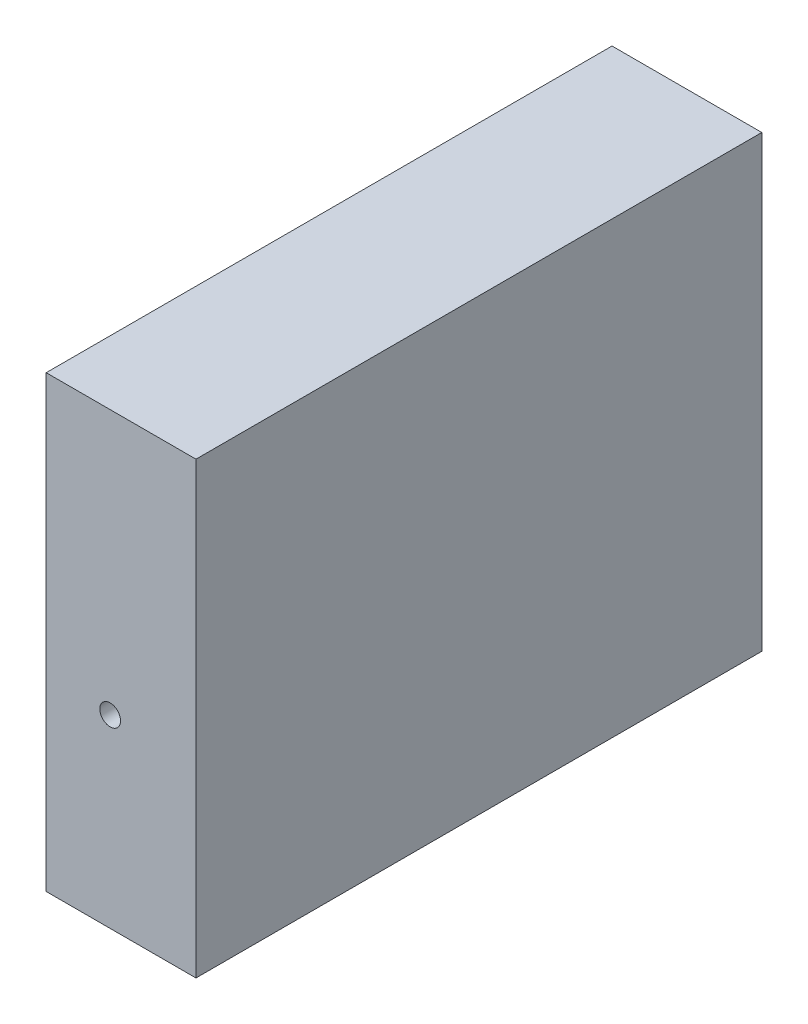
ISO-10303-21;
HEADER;
FILE_DESCRIPTION(('STEP AP214'),'2;1');
FILE_NAME('part.step','',(''),(''),'','','');
FILE_SCHEMA(('AUTOMOTIVE_DESIGN { 1 0 10303 214 1 1 1 1 }'));
ENDSEC;
DATA;
#1=APPLICATION_CONTEXT('core data for automotive mechanical design processes');
#2=APPLICATION_PROTOCOL_DEFINITION('international standard','automotive_design',2000,#1);
#3=PRODUCT_CONTEXT('',#1,'mechanical');
#4=PRODUCT('Part','Part','',(#3));
#5=PRODUCT_RELATED_PRODUCT_CATEGORY('part','',(#4));
#6=PRODUCT_DEFINITION_FORMATION('','',#4);
#7=PRODUCT_DEFINITION_CONTEXT('part definition',#1,'design');
#8=PRODUCT_DEFINITION('design','',#6,#7);
#9=PRODUCT_DEFINITION_SHAPE('','',#8);
#10=(LENGTH_UNIT() NAMED_UNIT(*) SI_UNIT(.MILLI.,.METRE.));
#11=(NAMED_UNIT(*) PLANE_ANGLE_UNIT() SI_UNIT($,.RADIAN.));
#12=(NAMED_UNIT(*) SI_UNIT($,.STERADIAN.) SOLID_ANGLE_UNIT());
#13=UNCERTAINTY_MEASURE_WITH_UNIT(LENGTH_MEASURE(1.E-05),#10,'distance_accuracy_value','');
#14=(GEOMETRIC_REPRESENTATION_CONTEXT(3) GLOBAL_UNCERTAINTY_ASSIGNED_CONTEXT((#13)) GLOBAL_UNIT_ASSIGNED_CONTEXT((#10,
#11,#12)) REPRESENTATION_CONTEXT('',''));
#15=CARTESIAN_POINT('',(0.,0.,0.));
#16=DIRECTION('',(0.,0.,1.));
#17=DIRECTION('',(1.,0.,0.));
#18=AXIS2_PLACEMENT_3D('',#15,#16,#17);
#19=CARTESIAN_POINT('',(0.,0.,-215.9));
#20=DIRECTION('',(1.,0.,0.));
#21=DIRECTION('',(0.,0.,1.));
#22=AXIS2_PLACEMENT_3D('',#19,#20,#21);
#23=PLANE('',#22);
#24=DIRECTION('',(0.,-1.,0.));
#25=VECTOR('',#24,1.);
#26=CARTESIAN_POINT('',(0.,0.,0.));
#27=LINE('',#26,#25);
#28=CARTESIAN_POINT('',(0.,171.45,0.));
#29=VERTEX_POINT('',#28);
#30=CARTESIAN_POINT('',(0.,0.,0.));
#31=VERTEX_POINT('',#30);
#32=EDGE_CURVE('E119',#29,#31,#27,.T.);
#33=ORIENTED_EDGE('',*,*,#32,.F.);
#34=DIRECTION('',(0.,0.,1.));
#35=VECTOR('',#34,1.);
#36=CARTESIAN_POINT('',(0.,171.45,-215.9));
#37=LINE('',#36,#35);
#38=CARTESIAN_POINT('',(0.,171.45,-215.9));
#39=VERTEX_POINT('',#38);
#40=EDGE_CURVE('E118',#39,#29,#37,.T.);
#41=ORIENTED_EDGE('',*,*,#40,.F.);
#42=DIRECTION('',(0.,-1.,0.));
#43=VECTOR('',#42,1.);
#44=CARTESIAN_POINT('',(0.,0.,-215.9));
#45=LINE('',#44,#43);
#46=CARTESIAN_POINT('',(0.,0.,-215.9));
#47=VERTEX_POINT('',#46);
#48=EDGE_CURVE('E109',#39,#47,#45,.T.);
#49=ORIENTED_EDGE('',*,*,#48,.T.);
#50=DIRECTION('',(0.,0.,1.));
#51=VECTOR('',#50,1.);
#52=CARTESIAN_POINT('',(0.,0.,-215.9));
#53=LINE('',#52,#51);
#54=EDGE_CURVE('E11',#47,#31,#53,.T.);
#55=ORIENTED_EDGE('',*,*,#54,.T.);
#56=EDGE_LOOP('',(#33,#41,#49,#55));
#57=FACE_BOUND('',#56,.T.);
#58=ADVANCED_FACE('F45',(#57),#23,.F.);
#59=CARTESIAN_POINT('',(0.,0.,-215.9));
#60=DIRECTION('',(0.,1.,0.));
#61=DIRECTION('',(0.,0.,-1.));
#62=AXIS2_PLACEMENT_3D('',#59,#60,#61);
#63=PLANE('',#62);
#64=DIRECTION('',(1.,0.,0.));
#65=VECTOR('',#64,1.);
#66=CARTESIAN_POINT('',(0.,0.,0.));
#67=LINE('',#66,#65);
#68=CARTESIAN_POINT('',(57.15,0.,0.));
#69=VERTEX_POINT('',#68);
#70=EDGE_CURVE('E122',#31,#69,#67,.T.);
#71=ORIENTED_EDGE('',*,*,#70,.F.);
#72=ORIENTED_EDGE('',*,*,#54,.F.);
#73=DIRECTION('',(1.,0.,0.));
#74=VECTOR('',#73,1.);
#75=CARTESIAN_POINT('',(0.,0.,-215.9));
#76=LINE('',#75,#74);
#77=CARTESIAN_POINT('',(57.15,0.,-215.9));
#78=VERTEX_POINT('',#77);
#79=EDGE_CURVE('E89',#47,#78,#76,.T.);
#80=ORIENTED_EDGE('',*,*,#79,.T.);
#81=DIRECTION('',(0.,0.,1.));
#82=VECTOR('',#81,1.);
#83=CARTESIAN_POINT('',(57.15,0.,-215.9));
#84=LINE('',#83,#82);
#85=EDGE_CURVE('E55',#78,#69,#84,.T.);
#86=ORIENTED_EDGE('',*,*,#85,.T.);
#87=EDGE_LOOP('',(#71,#72,#80,#86));
#88=FACE_BOUND('',#87,.T.);
#89=ADVANCED_FACE('F106',(#88),#63,.F.);
#90=CARTESIAN_POINT('',(57.15,0.,-215.9));
#91=DIRECTION('',(-1.,0.,0.));
#92=DIRECTION('',(0.,0.,-1.));
#93=AXIS2_PLACEMENT_3D('',#90,#91,#92);
#94=PLANE('',#93);
#95=DIRECTION('',(0.,1.,0.));
#96=VECTOR('',#95,1.);
#97=CARTESIAN_POINT('',(57.15,0.,0.));
#98=LINE('',#97,#96);
#99=CARTESIAN_POINT('',(57.15,171.45,0.));
#100=VERTEX_POINT('',#99);
#101=EDGE_CURVE('E100',#69,#100,#98,.T.);
#102=ORIENTED_EDGE('',*,*,#101,.F.);
#103=ORIENTED_EDGE('',*,*,#85,.F.);
#104=DIRECTION('',(0.,1.,0.));
#105=VECTOR('',#104,1.);
#106=CARTESIAN_POINT('',(57.15,0.,-215.9));
#107=LINE('',#106,#105);
#108=CARTESIAN_POINT('',(57.15,171.45,-215.9));
#109=VERTEX_POINT('',#108);
#110=EDGE_CURVE('E92',#78,#109,#107,.T.);
#111=ORIENTED_EDGE('',*,*,#110,.T.);
#112=DIRECTION('',(0.,0.,1.));
#113=VECTOR('',#112,1.);
#114=CARTESIAN_POINT('',(57.15,171.45,-215.9));
#115=LINE('',#114,#113);
#116=EDGE_CURVE('E104',#109,#100,#115,.T.);
#117=ORIENTED_EDGE('',*,*,#116,.T.);
#118=EDGE_LOOP('',(#102,#103,#111,#117));
#119=FACE_BOUND('',#118,.T.);
#120=ADVANCED_FACE('F99',(#119),#94,.F.);
#121=CARTESIAN_POINT('',(0.,171.45,-215.9));
#122=DIRECTION('',(0.,-1.,0.));
#123=DIRECTION('',(0.,0.,1.));
#124=AXIS2_PLACEMENT_3D('',#121,#122,#123);
#125=PLANE('',#124);
#126=DIRECTION('',(-1.,0.,0.));
#127=VECTOR('',#126,1.);
#128=CARTESIAN_POINT('',(0.,171.45,0.));
#129=LINE('',#128,#127);
#130=EDGE_CURVE('E78',#100,#29,#129,.T.);
#131=ORIENTED_EDGE('',*,*,#130,.F.);
#132=ORIENTED_EDGE('',*,*,#116,.F.);
#133=DIRECTION('',(-1.,0.,0.));
#134=VECTOR('',#133,1.);
#135=CARTESIAN_POINT('',(0.,171.45,-215.9));
#136=LINE('',#135,#134);
#137=EDGE_CURVE('E64',#109,#39,#136,.T.);
#138=ORIENTED_EDGE('',*,*,#137,.T.);
#139=ORIENTED_EDGE('',*,*,#40,.T.);
#140=EDGE_LOOP('',(#131,#132,#138,#139));
#141=FACE_BOUND('',#140,.T.);
#142=ADVANCED_FACE('F212',(#141),#125,.F.);
#143=CARTESIAN_POINT('',(0.,0.,-215.9));
#144=DIRECTION('',(0.,0.,1.));
#145=DIRECTION('',(-1.,0.,0.));
#146=AXIS2_PLACEMENT_3D('',#143,#144,#145);
#147=PLANE('',#146);
#148=CARTESIAN_POINT('',(23.13,10.5690000000002,-215.9));
#149=DIRECTION('',(0.,0.,1.));
#150=DIRECTION('',(1.,0.,0.));
#151=AXIS2_PLACEMENT_3D('',#148,#149,#150);
#152=CIRCLE('',#151,3.96874999999996);
#153=CARTESIAN_POINT('',(27.0987499999999,10.5690000000002,-215.9));
#154=VERTEX_POINT('',#153);
#155=EDGE_CURVE('E395',#154,#154,#152,.T.);
#156=ORIENTED_EDGE('',*,*,#155,.T.);
#157=EDGE_LOOP('',(#156));
#158=FACE_BOUND('',#157,.T.);
#159=CARTESIAN_POINT('',(26.41,98.5690000000001,-215.9));
#160=DIRECTION('',(0.,0.,1.));
#161=DIRECTION('',(1.,0.,0.));
#162=AXIS2_PLACEMENT_3D('',#159,#160,#161);
#163=CIRCLE('',#162,3.96874999999997);
#164=CARTESIAN_POINT('',(30.37875,98.5690000000001,-215.9));
#165=VERTEX_POINT('',#164);
#166=EDGE_CURVE('E406',#165,#165,#163,.T.);
#167=ORIENTED_EDGE('',*,*,#166,.T.);
#168=EDGE_LOOP('',(#167));
#169=FACE_BOUND('',#168,.T.);
#170=CARTESIAN_POINT('',(26.41,73.5690000000001,-215.9));
#171=DIRECTION('',(0.,0.,1.));
#172=DIRECTION('',(1.,0.,0.));
#173=AXIS2_PLACEMENT_3D('',#170,#171,#172);
#174=CIRCLE('',#173,3.96874999999997);
#175=CARTESIAN_POINT('',(30.37875,73.5690000000001,-215.9));
#176=VERTEX_POINT('',#175);
#177=EDGE_CURVE('E393',#176,#176,#174,.T.);
#178=ORIENTED_EDGE('',*,*,#177,.T.);
#179=EDGE_LOOP('',(#178));
#180=FACE_BOUND('',#179,.T.);
#181=ORIENTED_EDGE('',*,*,#48,.F.);
#182=ORIENTED_EDGE('',*,*,#137,.F.);
#183=ORIENTED_EDGE('',*,*,#110,.F.);
#184=ORIENTED_EDGE('',*,*,#79,.F.);
#185=EDGE_LOOP('',(#181,#182,#183,#184));
#186=FACE_BOUND('',#185,.T.);
#187=ADVANCED_FACE('F94',(#158,#169,#180,#186),#147,.F.);
#188=CARTESIAN_POINT('',(0.,0.,0.));
#189=DIRECTION('',(0.,0.,1.));
#190=DIRECTION('',(-1.,0.,0.));
#191=AXIS2_PLACEMENT_3D('',#188,#189,#190);
#192=PLANE('',#191);
#193=CARTESIAN_POINT('',(24.41,70.5690000000001,0.));
#194=DIRECTION('',(0.,0.,-1.));
#195=DIRECTION('',(-1.,0.,0.));
#196=AXIS2_PLACEMENT_3D('',#193,#194,#195);
#197=CIRCLE('',#196,3.96874999999997);
#198=CARTESIAN_POINT('',(20.4412500000001,70.5690000000001,0.));
#199=VERTEX_POINT('',#198);
#200=EDGE_CURVE('E167',#199,#199,#197,.T.);
#201=ORIENTED_EDGE('',*,*,#200,.T.);
#202=EDGE_LOOP('',(#201));
#203=FACE_BOUND('',#202,.T.);
#204=ORIENTED_EDGE('',*,*,#32,.T.);
#205=ORIENTED_EDGE('',*,*,#70,.T.);
#206=ORIENTED_EDGE('',*,*,#101,.T.);
#207=ORIENTED_EDGE('',*,*,#130,.T.);
#208=EDGE_LOOP('',(#204,#205,#206,#207));
#209=FACE_BOUND('',#208,.T.);
#210=ADVANCED_FACE('F202',(#203,#209),#192,.T.);
#211=CARTESIAN_POINT('',(24.41,70.5690000000001,-13.0400044));
#212=DIRECTION('',(0.,0.,1.));
#213=DIRECTION('',(-1.,0.,0.));
#214=AXIS2_PLACEMENT_3D('',#211,#212,#213);
#215=PLANE('',#214);
#216=CARTESIAN_POINT('',(24.41,70.5690000000001,-13.0400044));
#217=DIRECTION('',(0.,0.,-1.));
#218=DIRECTION('',(-1.,0.,0.));
#219=AXIS2_PLACEMENT_3D('',#216,#217,#218);
#220=CIRCLE('',#219,3.96874999999997);
#221=CARTESIAN_POINT('',(20.4412500000001,70.5690000000001,-13.0400044));
#222=VERTEX_POINT('',#221);
#223=EDGE_CURVE('E138',#222,#222,#220,.T.);
#224=ORIENTED_EDGE('',*,*,#223,.F.);
#225=EDGE_LOOP('',(#224));
#226=FACE_BOUND('',#225,.T.);
#227=CARTESIAN_POINT('',(24.41,70.5690000000001,-13.0400044));
#228=DIRECTION('',(0.,0.,-1.));
#229=DIRECTION('',(-1.,0.,0.));
#230=AXIS2_PLACEMENT_3D('',#227,#228,#229);
#231=CIRCLE('',#230,3.17500000000004);
#232=CARTESIAN_POINT('',(21.235,70.5690000000001,-13.0400044));
#233=VERTEX_POINT('',#232);
#234=EDGE_CURVE('E134',#233,#233,#231,.F.);
#235=ORIENTED_EDGE('',*,*,#234,.F.);
#236=EDGE_LOOP('',(#235));
#237=FACE_BOUND('',#236,.T.);
#238=ADVANCED_FACE('F192',(#226,#237),#215,.T.);
#239=CARTESIAN_POINT('',(24.41,70.5690000000001,-13.0400044));
#240=DIRECTION('',(0.,0.,1.));
#241=DIRECTION('',(-1.,0.,0.));
#242=AXIS2_PLACEMENT_3D('',#239,#240,#241);
#243=CYLINDRICAL_SURFACE('',#242,3.96874999999997);
#244=ORIENTED_EDGE('',*,*,#223,.T.);
#245=EDGE_LOOP('',(#244));
#246=FACE_BOUND('',#245,.T.);
#247=ORIENTED_EDGE('',*,*,#200,.F.);
#248=EDGE_LOOP('',(#247));
#249=FACE_BOUND('',#248,.T.);
#250=ADVANCED_FACE('F184',(#246,#249),#243,.F.);
#251=CARTESIAN_POINT('',(24.41,70.5690000000001,-46.7399878));
#252=DIRECTION('',(0.,0.,1.));
#253=DIRECTION('',(-1.,0.,0.));
#254=AXIS2_PLACEMENT_3D('',#251,#252,#253);
#255=PLANE('',#254);
#256=CARTESIAN_POINT('',(24.41,70.5690000000001,-46.7399878));
#257=DIRECTION('',(0.,0.,-1.));
#258=DIRECTION('',(-1.,0.,0.));
#259=AXIS2_PLACEMENT_3D('',#256,#257,#258);
#260=CIRCLE('',#259,3.17500000000004);
#261=CARTESIAN_POINT('',(21.235,70.5690000000001,-46.7399878));
#262=VERTEX_POINT('',#261);
#263=EDGE_CURVE('E123',#262,#262,#260,.T.);
#264=ORIENTED_EDGE('',*,*,#263,.F.);
#265=EDGE_LOOP('',(#264));
#266=FACE_BOUND('',#265,.T.);
#267=ADVANCED_FACE('F182',(#266),#255,.T.);
#268=CARTESIAN_POINT('',(24.41,70.5690000000001,-46.7399878));
#269=DIRECTION('',(0.,0.,1.));
#270=DIRECTION('',(-1.,0.,0.));
#271=AXIS2_PLACEMENT_3D('',#268,#269,#270);
#272=CYLINDRICAL_SURFACE('',#271,3.17500000000004);
#273=CARTESIAN_POINT('',(21.235,70.5690000000001,-46.7399878));
#274=CARTESIAN_POINT('',(21.235,70.5690000000001,-46.38894630625));
#275=CARTESIAN_POINT('',(21.235,70.5690000000001,-46.0379048125));
#276=CARTESIAN_POINT('',(21.235,70.5690000000001,-45.335821825));
#277=CARTESIAN_POINT('',(21.235,70.5690000000001,-44.98478033125));
#278=CARTESIAN_POINT('',(21.235,70.5690000000001,-44.28269734375));
#279=CARTESIAN_POINT('',(21.235,70.5690000000001,-43.93165585));
#280=CARTESIAN_POINT('',(21.235,70.5690000000001,-43.2295728625));
#281=CARTESIAN_POINT('',(21.235,70.5690000000001,-42.87853136875));
#282=CARTESIAN_POINT('',(21.235,70.5690000000001,-42.17644838125));
#283=CARTESIAN_POINT('',(21.235,70.5690000000001,-41.8254068875));
#284=CARTESIAN_POINT('',(21.235,70.5690000000001,-41.1233239));
#285=CARTESIAN_POINT('',(21.235,70.5690000000001,-40.77228240625));
#286=CARTESIAN_POINT('',(21.235,70.5690000000001,-40.07019941875));
#287=CARTESIAN_POINT('',(21.235,70.5690000000001,-39.719157925));
#288=CARTESIAN_POINT('',(21.235,70.5690000000001,-39.0170749375));
#289=CARTESIAN_POINT('',(21.235,70.5690000000001,-38.66603344375));
#290=CARTESIAN_POINT('',(21.235,70.5690000000001,-37.96395045625));
#291=CARTESIAN_POINT('',(21.235,70.5690000000001,-37.6129089625));
#292=CARTESIAN_POINT('',(21.235,70.5690000000001,-36.910825975));
#293=CARTESIAN_POINT('',(21.235,70.5690000000001,-36.55978448125));
#294=CARTESIAN_POINT('',(21.235,70.5690000000001,-35.85770149375));
#295=CARTESIAN_POINT('',(21.235,70.5690000000001,-35.50666));
#296=CARTESIAN_POINT('',(21.235,70.5690000000001,-34.8045770125));
#297=CARTESIAN_POINT('',(21.235,70.5690000000001,-34.45353551875));
#298=CARTESIAN_POINT('',(21.235,70.5690000000001,-33.75145253125));
#299=CARTESIAN_POINT('',(21.235,70.5690000000001,-33.4004110375));
#300=CARTESIAN_POINT('',(21.235,70.5690000000001,-32.69832805));
#301=CARTESIAN_POINT('',(21.235,70.5690000000001,-32.34728655625));
#302=CARTESIAN_POINT('',(21.235,70.5690000000001,-31.64520356875));
#303=CARTESIAN_POINT('',(21.235,70.5690000000001,-31.294162075));
#304=CARTESIAN_POINT('',(21.235,70.5690000000001,-30.5920790875));
#305=CARTESIAN_POINT('',(21.235,70.5690000000001,-30.24103759375));
#306=CARTESIAN_POINT('',(21.235,70.5690000000001,-29.53895460625));
#307=CARTESIAN_POINT('',(21.235,70.5690000000001,-29.1879131125));
#308=CARTESIAN_POINT('',(21.235,70.5690000000001,-28.485830125));
#309=CARTESIAN_POINT('',(21.235,70.5690000000001,-28.13478863125));
#310=CARTESIAN_POINT('',(21.235,70.5690000000001,-27.43270564375));
#311=CARTESIAN_POINT('',(21.235,70.5690000000001,-27.08166415));
#312=CARTESIAN_POINT('',(21.235,70.5690000000001,-26.3795811625));
#313=CARTESIAN_POINT('',(21.235,70.5690000000001,-26.02853966875));
#314=CARTESIAN_POINT('',(21.235,70.5690000000001,-25.32645668125));
#315=CARTESIAN_POINT('',(21.235,70.5690000000001,-24.9754151875));
#316=CARTESIAN_POINT('',(21.235,70.5690000000001,-24.2733322));
#317=CARTESIAN_POINT('',(21.235,70.5690000000001,-23.92229070625));
#318=CARTESIAN_POINT('',(21.235,70.5690000000001,-23.22020771875));
#319=CARTESIAN_POINT('',(21.235,70.5690000000001,-22.869166225));
#320=CARTESIAN_POINT('',(21.235,70.5690000000001,-22.1670832375));
#321=CARTESIAN_POINT('',(21.235,70.5690000000001,-21.81604174375));
#322=CARTESIAN_POINT('',(21.235,70.5690000000001,-21.11395875625));
#323=CARTESIAN_POINT('',(21.235,70.5690000000001,-20.7629172625));
#324=CARTESIAN_POINT('',(21.235,70.5690000000001,-20.060834275));
#325=CARTESIAN_POINT('',(21.235,70.5690000000001,-19.70979278125));
#326=CARTESIAN_POINT('',(21.235,70.5690000000001,-19.00770979375));
#327=CARTESIAN_POINT('',(21.235,70.5690000000001,-18.6566683));
#328=CARTESIAN_POINT('',(21.235,70.5690000000001,-17.9545853125));
#329=CARTESIAN_POINT('',(21.235,70.5690000000001,-17.60354381875));
#330=CARTESIAN_POINT('',(21.235,70.5690000000001,-16.90146083125));
#331=CARTESIAN_POINT('',(21.235,70.5690000000001,-16.5504193375));
#332=CARTESIAN_POINT('',(21.235,70.5690000000001,-15.84833635));
#333=CARTESIAN_POINT('',(21.235,70.5690000000001,-15.49729485625));
#334=CARTESIAN_POINT('',(21.235,70.5690000000001,-14.79521186875));
#335=CARTESIAN_POINT('',(21.235,70.5690000000001,-14.444170375));
#336=CARTESIAN_POINT('',(21.235,70.5690000000001,-13.7420873875));
#337=CARTESIAN_POINT('',(21.235,70.5690000000001,-13.39104589375));
#338=CARTESIAN_POINT('',(21.235,70.5690000000001,-13.0400044));
#339=B_SPLINE_CURVE_WITH_KNOTS('',3,(#273,#274,#275,#276,#277,#278,#279,#280,#281,#282,#283,
#284,#285,#286,#287,#288,#289,#290,#291,#292,#293,#294,#295,#296,#297,#298,#299,#300,#301,#302,
#303,#304,#305,#306,#307,#308,#309,#310,#311,#312,#313,#314,#315,#316,#317,#318,#319,#320,#321,
#322,#323,#324,#325,#326,#327,#328,#329,#330,#331,#332,#333,#334,#335,#336,#337,#338),
.UNSPECIFIED.,.F.,.F.,(4,2,2,2,2,2,2,2,2,2,2,2,2,2,2,2,2,2,2,2,2,2,2,2,2,2,2,2,2,2,2,2,4),(0.,
1.05312448125,2.1062489625,3.15937344375,4.212497925,5.26562240625,6.3187468875,
7.37187136875001,8.42499585000001,9.47812033125001,10.5312448125,11.58436929375,12.637493775,
13.69061825625,14.7437427375,15.79686721875,16.8499917,17.90311618125,18.9562406625,
20.00936514375,21.062489625,22.11561410625,23.1687385875,24.22186306875,25.27498755,
26.32811203125,27.3812365125,28.43436099375,29.487485475,30.54060995625,31.5937344375,
32.64685891875,33.6999834),.UNSPECIFIED.);
#340=EDGE_CURVE('BSEAM179',#262,#233,#339,.T.);
#341=ORIENTED_EDGE('',*,*,#263,.T.);
#342=ORIENTED_EDGE('',*,*,#234,.T.);
#343=ORIENTED_EDGE('',*,*,#340,.T.);
#344=ORIENTED_EDGE('',*,*,#340,.F.);
#345=EDGE_LOOP('',(#341,#343,#342,#344));
#346=FACE_BOUND('',#345,.T.);
#347=ADVANCED_FACE('F179',(#346),#272,.F.);
#348=CARTESIAN_POINT('',(26.41,98.5690000000001,-205.74));
#349=DIRECTION('',(0.,0.,-1.));
#350=DIRECTION('',(1.,0.,0.));
#351=AXIS2_PLACEMENT_3D('',#348,#349,#350);
#352=PLANE('',#351);
#353=CARTESIAN_POINT('',(26.41,98.5690000000001,-205.74));
#354=DIRECTION('',(0.,0.,1.));
#355=DIRECTION('',(1.,0.,0.));
#356=AXIS2_PLACEMENT_3D('',#353,#354,#355);
#357=CIRCLE('',#356,3.96874999999997);
#358=CARTESIAN_POINT('',(30.37875,98.5690000000001,-205.74));
#359=VERTEX_POINT('',#358);
#360=EDGE_CURVE('E143',#359,#359,#357,.T.);
#361=ORIENTED_EDGE('',*,*,#360,.F.);
#362=EDGE_LOOP('',(#361));
#363=FACE_BOUND('',#362,.T.);
#364=CARTESIAN_POINT('',(26.41,98.5690000000001,-205.74));
#365=DIRECTION('',(0.,0.,1.));
#366=DIRECTION('',(1.,0.,0.));
#367=AXIS2_PLACEMENT_3D('',#364,#365,#366);
#368=CIRCLE('',#367,3.17500000000004);
#369=CARTESIAN_POINT('',(29.5850000000001,98.5690000000001,-205.74));
#370=VERTEX_POINT('',#369);
#371=EDGE_CURVE('E139',#370,#370,#368,.F.);
#372=ORIENTED_EDGE('',*,*,#371,.F.);
#373=EDGE_LOOP('',(#372));
#374=FACE_BOUND('',#373,.T.);
#375=ADVANCED_FACE('F190',(#363,#374),#352,.T.);
#376=CARTESIAN_POINT('',(26.41,98.5690000000001,-205.74));
#377=DIRECTION('',(0.,0.,-1.));
#378=DIRECTION('',(1.,0.,0.));
#379=AXIS2_PLACEMENT_3D('',#376,#377,#378);
#380=CYLINDRICAL_SURFACE('',#379,3.96874999999997);
#381=ORIENTED_EDGE('',*,*,#360,.T.);
#382=EDGE_LOOP('',(#381));
#383=FACE_BOUND('',#382,.T.);
#384=ORIENTED_EDGE('',*,*,#166,.F.);
#385=EDGE_LOOP('',(#384));
#386=FACE_BOUND('',#385,.T.);
#387=ADVANCED_FACE('F272',(#383,#386),#380,.F.);
#388=CARTESIAN_POINT('',(26.41,73.5690000000001,-205.74));
#389=DIRECTION('',(0.,0.,-1.));
#390=DIRECTION('',(1.,0.,0.));
#391=AXIS2_PLACEMENT_3D('',#388,#389,#390);
#392=PLANE('',#391);
#393=CARTESIAN_POINT('',(26.41,73.5690000000001,-205.74));
#394=DIRECTION('',(0.,0.,1.));
#395=DIRECTION('',(1.,0.,0.));
#396=AXIS2_PLACEMENT_3D('',#393,#394,#395);
#397=CIRCLE('',#396,3.96874999999997);
#398=CARTESIAN_POINT('',(30.37875,73.5690000000001,-205.74));
#399=VERTEX_POINT('',#398);
#400=EDGE_CURVE('E163',#399,#399,#397,.T.);
#401=ORIENTED_EDGE('',*,*,#400,.F.);
#402=EDGE_LOOP('',(#401));
#403=FACE_BOUND('',#402,.T.);
#404=CARTESIAN_POINT('',(26.41,73.5690000000001,-205.74));
#405=DIRECTION('',(0.,0.,1.));
#406=DIRECTION('',(1.,0.,0.));
#407=AXIS2_PLACEMENT_3D('',#404,#405,#406);
#408=CIRCLE('',#407,3.17500000000004);
#409=CARTESIAN_POINT('',(29.5850000000001,73.5690000000001,-205.74));
#410=VERTEX_POINT('',#409);
#411=EDGE_CURVE('E142',#410,#410,#408,.F.);
#412=ORIENTED_EDGE('',*,*,#411,.F.);
#413=EDGE_LOOP('',(#412));
#414=FACE_BOUND('',#413,.T.);
#415=ADVANCED_FACE('F283',(#403,#414),#392,.T.);
#416=CARTESIAN_POINT('',(26.41,73.5690000000001,-205.74));
#417=DIRECTION('',(0.,0.,-1.));
#418=DIRECTION('',(1.,0.,0.));
#419=AXIS2_PLACEMENT_3D('',#416,#417,#418);
#420=CYLINDRICAL_SURFACE('',#419,3.96874999999997);
#421=ORIENTED_EDGE('',*,*,#400,.T.);
#422=EDGE_LOOP('',(#421));
#423=FACE_BOUND('',#422,.T.);
#424=ORIENTED_EDGE('',*,*,#177,.F.);
#425=EDGE_LOOP('',(#424));
#426=FACE_BOUND('',#425,.T.);
#427=ADVANCED_FACE('F294',(#423,#426),#420,.F.);
#428=CARTESIAN_POINT('',(26.41,98.5690000000001,-180.7399992));
#429=DIRECTION('',(0.,0.,-1.));
#430=DIRECTION('',(1.,0.,0.));
#431=AXIS2_PLACEMENT_3D('',#428,#429,#430);
#432=PLANE('',#431);
#433=CARTESIAN_POINT('',(26.41,98.5690000000001,-180.7399992));
#434=DIRECTION('',(0.,0.,1.));
#435=DIRECTION('',(1.,0.,0.));
#436=AXIS2_PLACEMENT_3D('',#433,#434,#435);
#437=CIRCLE('',#436,3.17500000000004);
#438=CARTESIAN_POINT('',(29.5850000000001,98.5690000000001,-180.7399992));
#439=VERTEX_POINT('',#438);
#440=EDGE_CURVE('E159',#439,#439,#437,.T.);
#441=ORIENTED_EDGE('',*,*,#440,.F.);
#442=EDGE_LOOP('',(#441));
#443=FACE_BOUND('',#442,.T.);
#444=ADVANCED_FACE('F305',(#443),#432,.T.);
#445=CARTESIAN_POINT('',(26.41,98.5690000000001,-180.7399992));
#446=DIRECTION('',(0.,0.,-1.));
#447=DIRECTION('',(1.,0.,0.));
#448=AXIS2_PLACEMENT_3D('',#445,#446,#447);
#449=CYLINDRICAL_SURFACE('',#448,3.17500000000004);
#450=ORIENTED_EDGE('',*,*,#440,.T.);
#451=EDGE_LOOP('',(#450));
#452=FACE_BOUND('',#451,.T.);
#453=ORIENTED_EDGE('',*,*,#371,.T.);
#454=EDGE_LOOP('',(#453));
#455=FACE_BOUND('',#454,.T.);
#456=ADVANCED_FACE('F314',(#452,#455),#449,.F.);
#457=CARTESIAN_POINT('',(26.41,73.5690000000001,-180.7399992));
#458=DIRECTION('',(0.,0.,-1.));
#459=DIRECTION('',(1.,0.,0.));
#460=AXIS2_PLACEMENT_3D('',#457,#458,#459);
#461=PLANE('',#460);
#462=CARTESIAN_POINT('',(26.41,73.5690000000001,-180.7399992));
#463=DIRECTION('',(0.,0.,1.));
#464=DIRECTION('',(1.,0.,0.));
#465=AXIS2_PLACEMENT_3D('',#462,#463,#464);
#466=CIRCLE('',#465,3.17500000000004);
#467=CARTESIAN_POINT('',(29.5850000000001,73.5690000000001,-180.7399992));
#468=VERTEX_POINT('',#467);
#469=EDGE_CURVE('E152',#468,#468,#466,.T.);
#470=ORIENTED_EDGE('',*,*,#469,.F.);
#471=EDGE_LOOP('',(#470));
#472=FACE_BOUND('',#471,.T.);
#473=ADVANCED_FACE('F324',(#472),#461,.T.);
#474=CARTESIAN_POINT('',(26.41,73.5690000000001,-180.7399992));
#475=DIRECTION('',(0.,0.,-1.));
#476=DIRECTION('',(1.,0.,0.));
#477=AXIS2_PLACEMENT_3D('',#474,#475,#476);
#478=CYLINDRICAL_SURFACE('',#477,3.17500000000004);
#479=ORIENTED_EDGE('',*,*,#469,.T.);
#480=EDGE_LOOP('',(#479));
#481=FACE_BOUND('',#480,.T.);
#482=ORIENTED_EDGE('',*,*,#411,.T.);
#483=EDGE_LOOP('',(#482));
#484=FACE_BOUND('',#483,.T.);
#485=ADVANCED_FACE('F334',(#481,#484),#478,.F.);
#486=CARTESIAN_POINT('',(23.13,10.5690000000002,-146.239992));
#487=DIRECTION('',(0.,0.,-1.));
#488=DIRECTION('',(1.,0.,0.));
#489=AXIS2_PLACEMENT_3D('',#486,#487,#488);
#490=PLANE('',#489);
#491=CARTESIAN_POINT('',(23.13,10.5690000000002,-146.239992));
#492=DIRECTION('',(0.,0.,1.));
#493=DIRECTION('',(1.,0.,0.));
#494=AXIS2_PLACEMENT_3D('',#491,#492,#493);
#495=CIRCLE('',#494,3.96874999999996);
#496=CARTESIAN_POINT('',(27.0987499999999,10.5690000000002,-146.239992));
#497=VERTEX_POINT('',#496);
#498=EDGE_CURVE('E388',#497,#497,#495,.T.);
#499=ORIENTED_EDGE('',*,*,#498,.F.);
#500=EDGE_LOOP('',(#499));
#501=FACE_BOUND('',#500,.T.);
#502=CARTESIAN_POINT('',(23.13,10.5690000000002,-146.239992));
#503=DIRECTION('',(0.,0.,1.));
#504=DIRECTION('',(1.,0.,0.));
#505=AXIS2_PLACEMENT_3D('',#502,#503,#504);
#506=CIRCLE('',#505,3.17500000000004);
#507=CARTESIAN_POINT('',(26.305,10.5690000000002,-146.239992));
#508=VERTEX_POINT('',#507);
#509=EDGE_CURVE('E48',#508,#508,#506,.F.);
#510=ORIENTED_EDGE('',*,*,#509,.F.);
#511=EDGE_LOOP('',(#510));
#512=FACE_BOUND('',#511,.T.);
#513=ADVANCED_FACE('F343',(#501,#512),#490,.T.);
#514=CARTESIAN_POINT('',(23.13,10.5690000000002,-146.239992));
#515=DIRECTION('',(0.,0.,-1.));
#516=DIRECTION('',(1.,0.,0.));
#517=AXIS2_PLACEMENT_3D('',#514,#515,#516);
#518=CYLINDRICAL_SURFACE('',#517,3.96874999999996);
#519=ORIENTED_EDGE('',*,*,#498,.T.);
#520=EDGE_LOOP('',(#519));
#521=FACE_BOUND('',#520,.T.);
#522=ORIENTED_EDGE('',*,*,#155,.F.);
#523=EDGE_LOOP('',(#522));
#524=FACE_BOUND('',#523,.T.);
#525=ADVANCED_FACE('F353',(#521,#524),#518,.F.);
#526=CARTESIAN_POINT('',(23.13,10.5690000000002,-121.2399912));
#527=DIRECTION('',(0.,0.,-1.));
#528=DIRECTION('',(1.,0.,0.));
#529=AXIS2_PLACEMENT_3D('',#526,#527,#528);
#530=PLANE('',#529);
#531=CARTESIAN_POINT('',(23.13,10.5690000000002,-121.2399912));
#532=DIRECTION('',(0.,0.,1.));
#533=DIRECTION('',(1.,0.,0.));
#534=AXIS2_PLACEMENT_3D('',#531,#532,#533);
#535=CIRCLE('',#534,3.17500000000004);
#536=CARTESIAN_POINT('',(26.305,10.5690000000002,-121.2399912));
#537=VERTEX_POINT('',#536);
#538=EDGE_CURVE('E146',#537,#537,#535,.T.);
#539=ORIENTED_EDGE('',*,*,#538,.F.);
#540=EDGE_LOOP('',(#539));
#541=FACE_BOUND('',#540,.T.);
#542=ADVANCED_FACE('F363',(#541),#530,.T.);
#543=CARTESIAN_POINT('',(23.13,10.5690000000002,-121.2399912));
#544=DIRECTION('',(0.,0.,-1.));
#545=DIRECTION('',(1.,0.,0.));
#546=AXIS2_PLACEMENT_3D('',#543,#544,#545);
#547=CYLINDRICAL_SURFACE('',#546,3.17500000000004);
#548=CARTESIAN_POINT('',(26.305,10.5690000000002,-121.2399912));
#549=CARTESIAN_POINT('',(26.305,10.5690000000002,-121.500407875));
#550=CARTESIAN_POINT('',(26.305,10.5690000000002,-121.76082455));
#551=CARTESIAN_POINT('',(26.305,10.5690000000002,-122.2816579));
#552=CARTESIAN_POINT('',(26.305,10.5690000000002,-122.542074575));
#553=CARTESIAN_POINT('',(26.305,10.5690000000002,-123.062907925));
#554=CARTESIAN_POINT('',(26.305,10.5690000000002,-123.3233246));
#555=CARTESIAN_POINT('',(26.305,10.5690000000002,-123.84415795));
#556=CARTESIAN_POINT('',(26.305,10.5690000000002,-124.104574625));
#557=CARTESIAN_POINT('',(26.305,10.5690000000002,-124.625407975));
#558=CARTESIAN_POINT('',(26.305,10.5690000000002,-124.88582465));
#559=CARTESIAN_POINT('',(26.305,10.5690000000002,-125.406658));
#560=CARTESIAN_POINT('',(26.305,10.5690000000002,-125.667074675));
#561=CARTESIAN_POINT('',(26.305,10.5690000000002,-126.187908025));
#562=CARTESIAN_POINT('',(26.305,10.5690000000002,-126.4483247));
#563=CARTESIAN_POINT('',(26.305,10.5690000000002,-126.96915805));
#564=CARTESIAN_POINT('',(26.305,10.5690000000002,-127.229574725));
#565=CARTESIAN_POINT('',(26.305,10.5690000000002,-127.750408075));
#566=CARTESIAN_POINT('',(26.305,10.5690000000002,-128.01082475));
#567=CARTESIAN_POINT('',(26.305,10.5690000000002,-128.5316581));
#568=CARTESIAN_POINT('',(26.305,10.5690000000002,-128.792074775));
#569=CARTESIAN_POINT('',(26.305,10.5690000000002,-129.312908125));
#570=CARTESIAN_POINT('',(26.305,10.5690000000002,-129.5733248));
#571=CARTESIAN_POINT('',(26.305,10.5690000000002,-130.09415815));
#572=CARTESIAN_POINT('',(26.305,10.5690000000002,-130.354574825));
#573=CARTESIAN_POINT('',(26.305,10.5690000000002,-130.875408175));
#574=CARTESIAN_POINT('',(26.305,10.5690000000002,-131.13582485));
#575=CARTESIAN_POINT('',(26.305,10.5690000000002,-131.6566582));
#576=CARTESIAN_POINT('',(26.305,10.5690000000002,-131.917074875));
#577=CARTESIAN_POINT('',(26.305,10.5690000000002,-132.437908225));
#578=CARTESIAN_POINT('',(26.305,10.5690000000002,-132.6983249));
#579=CARTESIAN_POINT('',(26.305,10.5690000000002,-133.21915825));
#580=CARTESIAN_POINT('',(26.305,10.5690000000002,-133.479574925));
#581=CARTESIAN_POINT('',(26.305,10.5690000000002,-134.000408275));
#582=CARTESIAN_POINT('',(26.305,10.5690000000002,-134.26082495));
#583=CARTESIAN_POINT('',(26.305,10.5690000000002,-134.7816583));
#584=CARTESIAN_POINT('',(26.305,10.5690000000002,-135.042074975));
#585=CARTESIAN_POINT('',(26.305,10.5690000000002,-135.562908325));
#586=CARTESIAN_POINT('',(26.305,10.5690000000002,-135.823325));
#587=CARTESIAN_POINT('',(26.305,10.5690000000002,-136.34415835));
#588=CARTESIAN_POINT('',(26.305,10.5690000000002,-136.604575025));
#589=CARTESIAN_POINT('',(26.305,10.5690000000002,-137.125408375));
#590=CARTESIAN_POINT('',(26.305,10.5690000000002,-137.38582505));
#591=CARTESIAN_POINT('',(26.305,10.5690000000002,-137.9066584));
#592=CARTESIAN_POINT('',(26.305,10.5690000000002,-138.167075075));
#593=CARTESIAN_POINT('',(26.305,10.5690000000002,-138.687908425));
#594=CARTESIAN_POINT('',(26.305,10.5690000000002,-138.9483251));
#595=CARTESIAN_POINT('',(26.305,10.5690000000002,-139.46915845));
#596=CARTESIAN_POINT('',(26.305,10.5690000000002,-139.729575125));
#597=CARTESIAN_POINT('',(26.305,10.5690000000002,-140.250408475));
#598=CARTESIAN_POINT('',(26.305,10.5690000000002,-140.51082515));
#599=CARTESIAN_POINT('',(26.305,10.5690000000002,-141.0316585));
#600=CARTESIAN_POINT('',(26.305,10.5690000000002,-141.292075175));
#601=CARTESIAN_POINT('',(26.305,10.5690000000002,-141.812908525));
#602=CARTESIAN_POINT('',(26.305,10.5690000000002,-142.0733252));
#603=CARTESIAN_POINT('',(26.305,10.5690000000002,-142.59415855));
#604=CARTESIAN_POINT('',(26.305,10.5690000000002,-142.854575225));
#605=CARTESIAN_POINT('',(26.305,10.5690000000002,-143.375408575));
#606=CARTESIAN_POINT('',(26.305,10.5690000000002,-143.63582525));
#607=CARTESIAN_POINT('',(26.305,10.5690000000002,-144.1566586));
#608=CARTESIAN_POINT('',(26.305,10.5690000000002,-144.417075275));
#609=CARTESIAN_POINT('',(26.305,10.5690000000002,-144.937908625));
#610=CARTESIAN_POINT('',(26.305,10.5690000000002,-145.1983253));
#611=CARTESIAN_POINT('',(26.305,10.5690000000002,-145.71915865));
#612=CARTESIAN_POINT('',(26.305,10.5690000000002,-145.979575325));
#613=CARTESIAN_POINT('',(26.305,10.5690000000002,-146.239992));
#614=B_SPLINE_CURVE_WITH_KNOTS('',3,(#548,#549,#550,#551,#552,#553,#554,#555,#556,#557,#558,
#559,#560,#561,#562,#563,#564,#565,#566,#567,#568,#569,#570,#571,#572,#573,#574,#575,#576,#577,
#578,#579,#580,#581,#582,#583,#584,#585,#586,#587,#588,#589,#590,#591,#592,#593,#594,#595,#596,
#597,#598,#599,#600,#601,#602,#603,#604,#605,#606,#607,#608,#609,#610,#611,#612,#613),
.UNSPECIFIED.,.F.,.F.,(4,2,2,2,2,2,2,2,2,2,2,2,2,2,2,2,2,2,2,2,2,2,2,2,2,2,2,2,2,2,2,2,4),(0.,
0.781250025000013,1.56250005000001,2.34375007500001,3.12500010000001,3.90625012500001,
4.68750015,5.46875017500001,6.25000020000002,7.03125022500001,7.81250025000002,8.59375027500001,
9.37500030000002,10.156250325,10.93750035,11.718750375,12.5000004,13.281250425,14.06250045,
14.843750475,15.6250005,16.406250525,17.18750055,17.968750575,18.7500006,19.531250625,
20.31250065,21.093750675,21.8750007,22.656250725,23.43750075,24.218750775,25.0000008),.UNSPECIFIED.);
#615=EDGE_CURVE('BSEAM372',#537,#508,#614,.T.);
#616=ORIENTED_EDGE('',*,*,#538,.T.);
#617=ORIENTED_EDGE('',*,*,#509,.T.);
#618=ORIENTED_EDGE('',*,*,#615,.T.);
#619=ORIENTED_EDGE('',*,*,#615,.F.);
#620=EDGE_LOOP('',(#616,#618,#617,#619));
#621=FACE_BOUND('',#620,.T.);
#622=ADVANCED_FACE('F372',(#621),#547,.F.);
#623=CLOSED_SHELL('',(#58,#89,#120,#142,#187,#210,#238,#250,#267,#347,#375,#387,#415,#427,#444,
#456,#473,#485,#513,#525,#542,#622));
#624=MANIFOLD_SOLID_BREP('B2',#623);
#625=ADVANCED_BREP_SHAPE_REPRESENTATION('',(#18,#624),#14);
#626=SHAPE_DEFINITION_REPRESENTATION(#9,#625);
ENDSEC;
END-ISO-10303-21;
